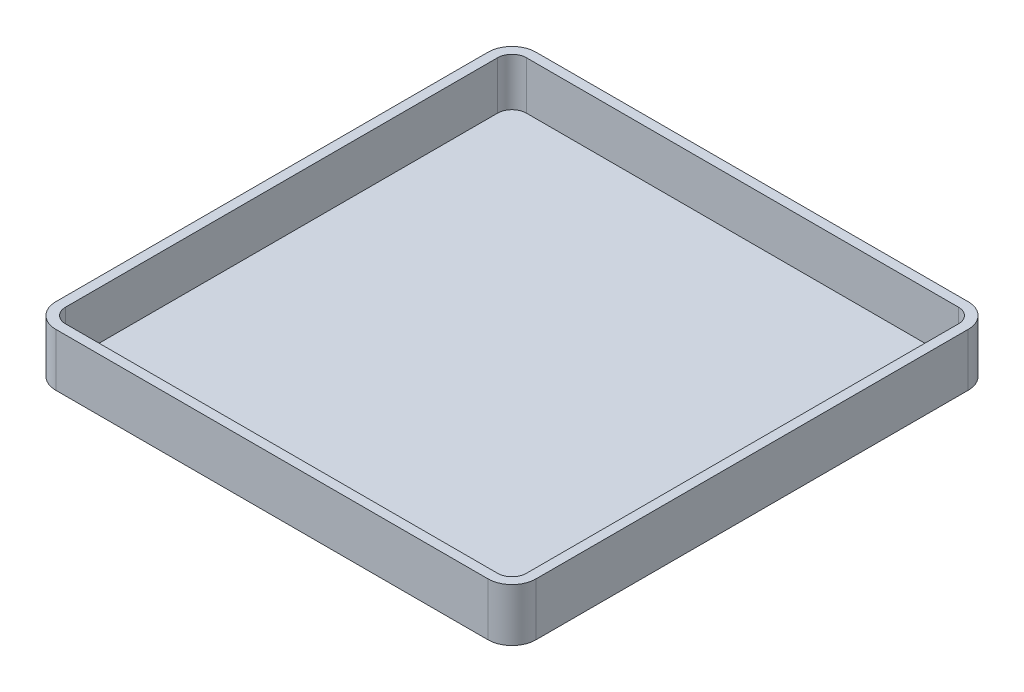
ISO-10303-21;
HEADER;
FILE_DESCRIPTION(('STEP AP214'),'2;1');
FILE_NAME('part.step','',(''),(''),'','','');
FILE_SCHEMA(('AUTOMOTIVE_DESIGN { 1 0 10303 214 1 1 1 1 }'));
ENDSEC;
DATA;
#1=APPLICATION_CONTEXT('core data for automotive mechanical design processes');
#2=APPLICATION_PROTOCOL_DEFINITION('international standard','automotive_design',2000,#1);
#3=PRODUCT_CONTEXT('',#1,'mechanical');
#4=PRODUCT('Part','Part','',(#3));
#5=PRODUCT_RELATED_PRODUCT_CATEGORY('part','',(#4));
#6=PRODUCT_DEFINITION_FORMATION('','',#4);
#7=PRODUCT_DEFINITION_CONTEXT('part definition',#1,'design');
#8=PRODUCT_DEFINITION('design','',#6,#7);
#9=PRODUCT_DEFINITION_SHAPE('','',#8);
#10=(LENGTH_UNIT() NAMED_UNIT(*) SI_UNIT(.MILLI.,.METRE.));
#11=(NAMED_UNIT(*) PLANE_ANGLE_UNIT() SI_UNIT($,.RADIAN.));
#12=(NAMED_UNIT(*) SI_UNIT($,.STERADIAN.) SOLID_ANGLE_UNIT());
#13=UNCERTAINTY_MEASURE_WITH_UNIT(LENGTH_MEASURE(1.E-05),#10,'distance_accuracy_value','');
#14=(GEOMETRIC_REPRESENTATION_CONTEXT(3) GLOBAL_UNCERTAINTY_ASSIGNED_CONTEXT((#13)) GLOBAL_UNIT_ASSIGNED_CONTEXT((#10,
#11,#12)) REPRESENTATION_CONTEXT('',''));
#15=CARTESIAN_POINT('',(0.,0.,0.));
#16=DIRECTION('',(0.,0.,1.));
#17=DIRECTION('',(1.,0.,0.));
#18=AXIS2_PLACEMENT_3D('',#15,#16,#17);
#19=CARTESIAN_POINT('',(0.,10.,0.));
#20=DIRECTION('',(0.,1.,0.));
#21=DIRECTION('',(0.,0.,1.));
#22=AXIS2_PLACEMENT_3D('',#19,#20,#21);
#23=PLANE('',#22);
#24=DIRECTION('',(0.,0.,1.));
#25=VECTOR('',#24,1.);
#26=CARTESIAN_POINT('',(-50.,10.,-50.));
#27=LINE('',#26,#25);
#28=CARTESIAN_POINT('',(-50.,10.,-45.));
#29=VERTEX_POINT('',#28);
#30=CARTESIAN_POINT('',(-50.,10.,45.));
#31=VERTEX_POINT('',#30);
#32=EDGE_CURVE('E262',#29,#31,#27,.T.);
#33=ORIENTED_EDGE('',*,*,#32,.T.);
#34=CARTESIAN_POINT('',(-45.,10.,45.));
#35=DIRECTION('',(0.,1.,0.));
#36=DIRECTION('',(0.,0.,1.));
#37=AXIS2_PLACEMENT_3D('',#34,#35,#36);
#38=CIRCLE('',#37,5.);
#39=CARTESIAN_POINT('',(-45.,10.,50.));
#40=VERTEX_POINT('',#39);
#41=EDGE_CURVE('E284',#31,#40,#38,.T.);
#42=ORIENTED_EDGE('',*,*,#41,.T.);
#43=DIRECTION('',(1.,0.,0.));
#44=VECTOR('',#43,1.);
#45=CARTESIAN_POINT('',(-50.,10.,50.));
#46=LINE('',#45,#44);
#47=CARTESIAN_POINT('',(45.,10.,50.));
#48=VERTEX_POINT('',#47);
#49=EDGE_CURVE('E192',#40,#48,#46,.T.);
#50=ORIENTED_EDGE('',*,*,#49,.T.);
#51=CARTESIAN_POINT('',(45.,10.,45.));
#52=DIRECTION('',(0.,1.,0.));
#53=DIRECTION('',(0.,0.,1.));
#54=AXIS2_PLACEMENT_3D('',#51,#52,#53);
#55=CIRCLE('',#54,5.);
#56=CARTESIAN_POINT('',(50.,10.,45.));
#57=VERTEX_POINT('',#56);
#58=EDGE_CURVE('E186',#48,#57,#55,.T.);
#59=ORIENTED_EDGE('',*,*,#58,.T.);
#60=DIRECTION('',(0.,0.,-1.));
#61=VECTOR('',#60,1.);
#62=CARTESIAN_POINT('',(50.,10.,-50.));
#63=LINE('',#62,#61);
#64=CARTESIAN_POINT('',(50.,10.,-45.));
#65=VERTEX_POINT('',#64);
#66=EDGE_CURVE('E240',#57,#65,#63,.T.);
#67=ORIENTED_EDGE('',*,*,#66,.T.);
#68=CARTESIAN_POINT('',(45.,10.,-45.));
#69=DIRECTION('',(0.,1.,0.));
#70=DIRECTION('',(0.,0.,1.));
#71=AXIS2_PLACEMENT_3D('',#68,#69,#70);
#72=CIRCLE('',#71,5.);
#73=CARTESIAN_POINT('',(45.,10.,-50.));
#74=VERTEX_POINT('',#73);
#75=EDGE_CURVE('E278',#65,#74,#72,.T.);
#76=ORIENTED_EDGE('',*,*,#75,.T.);
#77=DIRECTION('',(-1.,0.,0.));
#78=VECTOR('',#77,1.);
#79=CARTESIAN_POINT('',(-50.,10.,-50.));
#80=LINE('',#79,#78);
#81=CARTESIAN_POINT('',(-45.,10.,-50.));
#82=VERTEX_POINT('',#81);
#83=EDGE_CURVE('E258',#74,#82,#80,.T.);
#84=ORIENTED_EDGE('',*,*,#83,.T.);
#85=CARTESIAN_POINT('',(-45.,10.,-45.));
#86=DIRECTION('',(0.,1.,0.));
#87=DIRECTION('',(0.,0.,1.));
#88=AXIS2_PLACEMENT_3D('',#85,#86,#87);
#89=CIRCLE('',#88,5.);
#90=EDGE_CURVE('E281',#82,#29,#89,.T.);
#91=ORIENTED_EDGE('',*,*,#90,.T.);
#92=EDGE_LOOP('',(#33,#42,#50,#59,#67,#76,#84,#91));
#93=FACE_BOUND('',#92,.T.);
#94=DIRECTION('',(-1.,0.,0.));
#95=VECTOR('',#94,1.);
#96=CARTESIAN_POINT('',(-50.,10.,-48.));
#97=LINE('',#96,#95);
#98=CARTESIAN_POINT('',(45.,10.,-48.));
#99=VERTEX_POINT('',#98);
#100=CARTESIAN_POINT('',(-45.,10.,-48.));
#101=VERTEX_POINT('',#100);
#102=EDGE_CURVE('E228',#99,#101,#97,.T.);
#103=ORIENTED_EDGE('',*,*,#102,.F.);
#104=CARTESIAN_POINT('',(45.,10.,-45.));
#105=DIRECTION('',(0.,1.,0.));
#106=DIRECTION('',(0.,0.,1.));
#107=AXIS2_PLACEMENT_3D('',#104,#105,#106);
#108=CIRCLE('',#107,3.);
#109=CARTESIAN_POINT('',(48.,10.,-45.));
#110=VERTEX_POINT('',#109);
#111=EDGE_CURVE('E344',#99,#110,#108,.F.);
#112=ORIENTED_EDGE('',*,*,#111,.T.);
#113=DIRECTION('',(0.,0.,-1.));
#114=VECTOR('',#113,1.);
#115=CARTESIAN_POINT('',(48.,10.,-50.));
#116=LINE('',#115,#114);
#117=CARTESIAN_POINT('',(48.,10.,45.));
#118=VERTEX_POINT('',#117);
#119=EDGE_CURVE('E224',#118,#110,#116,.T.);
#120=ORIENTED_EDGE('',*,*,#119,.F.);
#121=CARTESIAN_POINT('',(45.,10.,45.));
#122=DIRECTION('',(0.,1.,0.));
#123=DIRECTION('',(0.,0.,1.));
#124=AXIS2_PLACEMENT_3D('',#121,#122,#123);
#125=CIRCLE('',#124,3.);
#126=CARTESIAN_POINT('',(45.,10.,48.));
#127=VERTEX_POINT('',#126);
#128=EDGE_CURVE('E337',#118,#127,#125,.F.);
#129=ORIENTED_EDGE('',*,*,#128,.T.);
#130=DIRECTION('',(1.,0.,0.));
#131=VECTOR('',#130,1.);
#132=CARTESIAN_POINT('',(-50.,10.,48.));
#133=LINE('',#132,#131);
#134=CARTESIAN_POINT('',(-45.,10.,48.));
#135=VERTEX_POINT('',#134);
#136=EDGE_CURVE('E236',#135,#127,#133,.T.);
#137=ORIENTED_EDGE('',*,*,#136,.F.);
#138=CARTESIAN_POINT('',(-45.,10.,45.));
#139=DIRECTION('',(0.,1.,0.));
#140=DIRECTION('',(0.,0.,1.));
#141=AXIS2_PLACEMENT_3D('',#138,#139,#140);
#142=CIRCLE('',#141,3.);
#143=CARTESIAN_POINT('',(-48.,10.,45.));
#144=VERTEX_POINT('',#143);
#145=EDGE_CURVE('E330',#135,#144,#142,.F.);
#146=ORIENTED_EDGE('',*,*,#145,.T.);
#147=DIRECTION('',(0.,0.,1.));
#148=VECTOR('',#147,1.);
#149=CARTESIAN_POINT('',(-48.,10.,-50.));
#150=LINE('',#149,#148);
#151=CARTESIAN_POINT('',(-48.,10.,-45.));
#152=VERTEX_POINT('',#151);
#153=EDGE_CURVE('E232',#152,#144,#150,.T.);
#154=ORIENTED_EDGE('',*,*,#153,.F.);
#155=CARTESIAN_POINT('',(-45.,10.,-45.));
#156=DIRECTION('',(0.,1.,0.));
#157=DIRECTION('',(0.,0.,1.));
#158=AXIS2_PLACEMENT_3D('',#155,#156,#157);
#159=CIRCLE('',#158,3.);
#160=EDGE_CURVE('E12',#152,#101,#159,.F.);
#161=ORIENTED_EDGE('',*,*,#160,.T.);
#162=EDGE_LOOP('',(#103,#112,#120,#129,#137,#146,#154,#161));
#163=FACE_BOUND('',#162,.T.);
#164=ADVANCED_FACE('F67',(#93,#163),#23,.T.);
#165=CARTESIAN_POINT('',(50.,10.,-50.));
#166=DIRECTION('',(-1.,0.,0.));
#167=DIRECTION('',(0.,0.,1.));
#168=AXIS2_PLACEMENT_3D('',#165,#166,#167);
#169=PLANE('',#168);
#170=DIRECTION('',(0.,-1.,0.));
#171=VECTOR('',#170,1.);
#172=CARTESIAN_POINT('',(50.,10.,45.));
#173=LINE('',#172,#171);
#174=CARTESIAN_POINT('',(50.,-1.,45.));
#175=VERTEX_POINT('',#174);
#176=EDGE_CURVE('E293',#57,#175,#173,.T.);
#177=ORIENTED_EDGE('',*,*,#176,.T.);
#178=DIRECTION('',(0.,0.,1.));
#179=VECTOR('',#178,1.);
#180=CARTESIAN_POINT('',(50.,-1.,-45.));
#181=LINE('',#180,#179);
#182=CARTESIAN_POINT('',(50.,-1.,-45.));
#183=VERTEX_POINT('',#182);
#184=EDGE_CURVE('E207',#183,#175,#181,.T.);
#185=ORIENTED_EDGE('',*,*,#184,.F.);
#186=DIRECTION('',(0.,-1.,0.));
#187=VECTOR('',#186,1.);
#188=CARTESIAN_POINT('',(50.,10.,-45.));
#189=LINE('',#188,#187);
#190=EDGE_CURVE('E296',#183,#65,#189,.F.);
#191=ORIENTED_EDGE('',*,*,#190,.T.);
#192=ORIENTED_EDGE('',*,*,#66,.F.);
#193=EDGE_LOOP('',(#177,#185,#191,#192));
#194=FACE_BOUND('',#193,.T.);
#195=ADVANCED_FACE('F386',(#194),#169,.F.);
#196=CARTESIAN_POINT('',(-50.,10.,-50.));
#197=DIRECTION('',(0.,0.,1.));
#198=DIRECTION('',(1.,0.,0.));
#199=AXIS2_PLACEMENT_3D('',#196,#197,#198);
#200=PLANE('',#199);
#201=DIRECTION('',(0.,-1.,0.));
#202=VECTOR('',#201,1.);
#203=CARTESIAN_POINT('',(45.,10.,-50.));
#204=LINE('',#203,#202);
#205=CARTESIAN_POINT('',(45.,-1.,-50.));
#206=VERTEX_POINT('',#205);
#207=EDGE_CURVE('E287',#74,#206,#204,.T.);
#208=ORIENTED_EDGE('',*,*,#207,.T.);
#209=DIRECTION('',(1.,0.,0.));
#210=VECTOR('',#209,1.);
#211=CARTESIAN_POINT('',(-45.,-1.,-50.));
#212=LINE('',#211,#210);
#213=CARTESIAN_POINT('',(-45.,-1.,-50.));
#214=VERTEX_POINT('',#213);
#215=EDGE_CURVE('E217',#214,#206,#212,.T.);
#216=ORIENTED_EDGE('',*,*,#215,.F.);
#217=DIRECTION('',(0.,-1.,0.));
#218=VECTOR('',#217,1.);
#219=CARTESIAN_POINT('',(-45.,10.,-50.));
#220=LINE('',#219,#218);
#221=EDGE_CURVE('E290',#214,#82,#220,.F.);
#222=ORIENTED_EDGE('',*,*,#221,.T.);
#223=ORIENTED_EDGE('',*,*,#83,.F.);
#224=EDGE_LOOP('',(#208,#216,#222,#223));
#225=FACE_BOUND('',#224,.T.);
#226=ADVANCED_FACE('F392',(#225),#200,.F.);
#227=CARTESIAN_POINT('',(-50.,10.,-50.));
#228=DIRECTION('',(1.,0.,0.));
#229=DIRECTION('',(0.,0.,-1.));
#230=AXIS2_PLACEMENT_3D('',#227,#228,#229);
#231=PLANE('',#230);
#232=DIRECTION('',(0.,-1.,0.));
#233=VECTOR('',#232,1.);
#234=CARTESIAN_POINT('',(-50.,10.,-45.));
#235=LINE('',#234,#233);
#236=CARTESIAN_POINT('',(-50.,-1.,-45.));
#237=VERTEX_POINT('',#236);
#238=EDGE_CURVE('E270',#29,#237,#235,.T.);
#239=ORIENTED_EDGE('',*,*,#238,.T.);
#240=DIRECTION('',(0.,0.,-1.));
#241=VECTOR('',#240,1.);
#242=CARTESIAN_POINT('',(-50.,-1.,45.));
#243=LINE('',#242,#241);
#244=CARTESIAN_POINT('',(-50.,-1.,45.));
#245=VERTEX_POINT('',#244);
#246=EDGE_CURVE('E211',#245,#237,#243,.T.);
#247=ORIENTED_EDGE('',*,*,#246,.F.);
#248=DIRECTION('',(0.,-1.,0.));
#249=VECTOR('',#248,1.);
#250=CARTESIAN_POINT('',(-50.,10.,45.));
#251=LINE('',#250,#249);
#252=EDGE_CURVE('E273',#245,#31,#251,.F.);
#253=ORIENTED_EDGE('',*,*,#252,.T.);
#254=ORIENTED_EDGE('',*,*,#32,.F.);
#255=EDGE_LOOP('',(#239,#247,#253,#254));
#256=FACE_BOUND('',#255,.T.);
#257=ADVANCED_FACE('F399',(#256),#231,.F.);
#258=CARTESIAN_POINT('',(-50.,10.,50.));
#259=DIRECTION('',(0.,0.,-1.));
#260=DIRECTION('',(-1.,0.,0.));
#261=AXIS2_PLACEMENT_3D('',#258,#259,#260);
#262=PLANE('',#261);
#263=ORIENTED_EDGE('',*,*,#49,.F.);
#264=DIRECTION('',(0.,-1.,0.));
#265=VECTOR('',#264,1.);
#266=CARTESIAN_POINT('',(-45.,10.,50.));
#267=LINE('',#266,#265);
#268=CARTESIAN_POINT('',(-45.,-1.,50.));
#269=VERTEX_POINT('',#268);
#270=EDGE_CURVE('E191',#40,#269,#267,.T.);
#271=ORIENTED_EDGE('',*,*,#270,.T.);
#272=DIRECTION('',(-1.,0.,0.));
#273=VECTOR('',#272,1.);
#274=CARTESIAN_POINT('',(45.,-1.,50.));
#275=LINE('',#274,#273);
#276=CARTESIAN_POINT('',(45.,-1.,50.));
#277=VERTEX_POINT('',#276);
#278=EDGE_CURVE('E195',#277,#269,#275,.T.);
#279=ORIENTED_EDGE('',*,*,#278,.F.);
#280=DIRECTION('',(0.,-1.,0.));
#281=VECTOR('',#280,1.);
#282=CARTESIAN_POINT('',(45.,10.,50.));
#283=LINE('',#282,#281);
#284=EDGE_CURVE('E180',#277,#48,#283,.F.);
#285=ORIENTED_EDGE('',*,*,#284,.T.);
#286=EDGE_LOOP('',(#263,#271,#279,#285));
#287=FACE_BOUND('',#286,.T.);
#288=ADVANCED_FACE('F196',(#287),#262,.F.);
#289=CARTESIAN_POINT('',(48.,10.,-50.));
#290=DIRECTION('',(-1.,0.,0.));
#291=DIRECTION('',(0.,0.,1.));
#292=AXIS2_PLACEMENT_3D('',#289,#290,#291);
#293=PLANE('',#292);
#294=DIRECTION('',(0.,0.,-1.));
#295=VECTOR('',#294,1.);
#296=CARTESIAN_POINT('',(48.,0.,-50.));
#297=LINE('',#296,#295);
#298=CARTESIAN_POINT('',(48.,0.,45.));
#299=VERTEX_POINT('',#298);
#300=CARTESIAN_POINT('',(48.,0.,-45.));
#301=VERTEX_POINT('',#300);
#302=EDGE_CURVE('E223',#299,#301,#297,.T.);
#303=ORIENTED_EDGE('',*,*,#302,.F.);
#304=DIRECTION('',(0.,-1.,0.));
#305=VECTOR('',#304,1.);
#306=CARTESIAN_POINT('',(48.,10.,45.));
#307=LINE('',#306,#305);
#308=EDGE_CURVE('E317',#299,#118,#307,.F.);
#309=ORIENTED_EDGE('',*,*,#308,.T.);
#310=ORIENTED_EDGE('',*,*,#119,.T.);
#311=DIRECTION('',(0.,-1.,0.));
#312=VECTOR('',#311,1.);
#313=CARTESIAN_POINT('',(48.,0.,-45.));
#314=LINE('',#313,#312);
#315=EDGE_CURVE('E313',#110,#301,#314,.T.);
#316=ORIENTED_EDGE('',*,*,#315,.T.);
#317=EDGE_LOOP('',(#303,#309,#310,#316));
#318=FACE_BOUND('',#317,.T.);
#319=ADVANCED_FACE('F360',(#318),#293,.T.);
#320=CARTESIAN_POINT('',(-50.,10.,-48.));
#321=DIRECTION('',(0.,0.,1.));
#322=DIRECTION('',(1.,0.,0.));
#323=AXIS2_PLACEMENT_3D('',#320,#321,#322);
#324=PLANE('',#323);
#325=DIRECTION('',(-1.,0.,0.));
#326=VECTOR('',#325,1.);
#327=CARTESIAN_POINT('',(-50.,0.,-48.));
#328=LINE('',#327,#326);
#329=CARTESIAN_POINT('',(45.,0.,-48.));
#330=VERTEX_POINT('',#329);
#331=CARTESIAN_POINT('',(-45.,0.,-48.));
#332=VERTEX_POINT('',#331);
#333=EDGE_CURVE('E244',#330,#332,#328,.T.);
#334=ORIENTED_EDGE('',*,*,#333,.F.);
#335=DIRECTION('',(0.,-1.,0.));
#336=VECTOR('',#335,1.);
#337=CARTESIAN_POINT('',(45.,10.,-48.));
#338=LINE('',#337,#336);
#339=EDGE_CURVE('E88',#330,#99,#338,.F.);
#340=ORIENTED_EDGE('',*,*,#339,.T.);
#341=ORIENTED_EDGE('',*,*,#102,.T.);
#342=DIRECTION('',(0.,-1.,0.));
#343=VECTOR('',#342,1.);
#344=CARTESIAN_POINT('',(-45.,0.,-48.));
#345=LINE('',#344,#343);
#346=EDGE_CURVE('E320',#101,#332,#345,.T.);
#347=ORIENTED_EDGE('',*,*,#346,.T.);
#348=EDGE_LOOP('',(#334,#340,#341,#347));
#349=FACE_BOUND('',#348,.T.);
#350=ADVANCED_FACE('F353',(#349),#324,.T.);
#351=CARTESIAN_POINT('',(-48.,10.,-50.));
#352=DIRECTION('',(1.,0.,0.));
#353=DIRECTION('',(0.,0.,-1.));
#354=AXIS2_PLACEMENT_3D('',#351,#352,#353);
#355=PLANE('',#354);
#356=ORIENTED_EDGE('',*,*,#153,.T.);
#357=DIRECTION('',(0.,-1.,0.));
#358=VECTOR('',#357,1.);
#359=CARTESIAN_POINT('',(-48.,0.,45.));
#360=LINE('',#359,#358);
#361=CARTESIAN_POINT('',(-48.,0.,45.));
#362=VERTEX_POINT('',#361);
#363=EDGE_CURVE('E302',#144,#362,#360,.T.);
#364=ORIENTED_EDGE('',*,*,#363,.T.);
#365=DIRECTION('',(0.,0.,1.));
#366=VECTOR('',#365,1.);
#367=CARTESIAN_POINT('',(-48.,0.,-50.));
#368=LINE('',#367,#366);
#369=CARTESIAN_POINT('',(-48.,0.,-45.));
#370=VERTEX_POINT('',#369);
#371=EDGE_CURVE('E248',#370,#362,#368,.T.);
#372=ORIENTED_EDGE('',*,*,#371,.F.);
#373=DIRECTION('',(0.,-1.,0.));
#374=VECTOR('',#373,1.);
#375=CARTESIAN_POINT('',(-48.,10.,-45.));
#376=LINE('',#375,#374);
#377=EDGE_CURVE('E299',#370,#152,#376,.F.);
#378=ORIENTED_EDGE('',*,*,#377,.T.);
#379=EDGE_LOOP('',(#356,#364,#372,#378));
#380=FACE_BOUND('',#379,.T.);
#381=ADVANCED_FACE('F375',(#380),#355,.T.);
#382=CARTESIAN_POINT('',(-50.,10.,48.));
#383=DIRECTION('',(0.,0.,-1.));
#384=DIRECTION('',(-1.,0.,0.));
#385=AXIS2_PLACEMENT_3D('',#382,#383,#384);
#386=PLANE('',#385);
#387=DIRECTION('',(1.,0.,0.));
#388=VECTOR('',#387,1.);
#389=CARTESIAN_POINT('',(-50.,0.,48.));
#390=LINE('',#389,#388);
#391=CARTESIAN_POINT('',(-45.,0.,48.));
#392=VERTEX_POINT('',#391);
#393=CARTESIAN_POINT('',(45.,0.,48.));
#394=VERTEX_POINT('',#393);
#395=EDGE_CURVE('E229',#392,#394,#390,.T.);
#396=ORIENTED_EDGE('',*,*,#395,.F.);
#397=DIRECTION('',(0.,-1.,0.));
#398=VECTOR('',#397,1.);
#399=CARTESIAN_POINT('',(-45.,10.,48.));
#400=LINE('',#399,#398);
#401=EDGE_CURVE('E310',#392,#135,#400,.F.);
#402=ORIENTED_EDGE('',*,*,#401,.T.);
#403=ORIENTED_EDGE('',*,*,#136,.T.);
#404=DIRECTION('',(0.,-1.,0.));
#405=VECTOR('',#404,1.);
#406=CARTESIAN_POINT('',(45.,0.,48.));
#407=LINE('',#406,#405);
#408=EDGE_CURVE('E306',#127,#394,#407,.T.);
#409=ORIENTED_EDGE('',*,*,#408,.T.);
#410=EDGE_LOOP('',(#396,#402,#403,#409));
#411=FACE_BOUND('',#410,.T.);
#412=ADVANCED_FACE('F368',(#411),#386,.T.);
#413=CARTESIAN_POINT('',(-45.,10.,45.));
#414=DIRECTION('',(0.,-1.,0.));
#415=DIRECTION('',(0.,0.,-1.));
#416=AXIS2_PLACEMENT_3D('',#413,#414,#415);
#417=CYLINDRICAL_SURFACE('',#416,5.);
#418=ORIENTED_EDGE('',*,*,#41,.F.);
#419=ORIENTED_EDGE('',*,*,#252,.F.);
#420=CARTESIAN_POINT('',(-45.,-1.,45.));
#421=DIRECTION('',(0.,-1.,0.));
#422=DIRECTION('',(0.,0.,-1.));
#423=AXIS2_PLACEMENT_3D('',#420,#421,#422);
#424=CIRCLE('',#423,5.);
#425=EDGE_CURVE('E201',#269,#245,#424,.T.);
#426=ORIENTED_EDGE('',*,*,#425,.F.);
#427=ORIENTED_EDGE('',*,*,#270,.F.);
#428=EDGE_LOOP('',(#418,#419,#426,#427));
#429=FACE_BOUND('',#428,.T.);
#430=ADVANCED_FACE('F382',(#429),#417,.T.);
#431=CARTESIAN_POINT('',(-45.,10.,-45.));
#432=DIRECTION('',(0.,-1.,0.));
#433=DIRECTION('',(0.,0.,-1.));
#434=AXIS2_PLACEMENT_3D('',#431,#432,#433);
#435=CYLINDRICAL_SURFACE('',#434,5.);
#436=ORIENTED_EDGE('',*,*,#90,.F.);
#437=ORIENTED_EDGE('',*,*,#221,.F.);
#438=CARTESIAN_POINT('',(-45.,-1.,-45.));
#439=DIRECTION('',(0.,-1.,0.));
#440=DIRECTION('',(0.,0.,-1.));
#441=AXIS2_PLACEMENT_3D('',#438,#439,#440);
#442=CIRCLE('',#441,5.);
#443=EDGE_CURVE('E214',#237,#214,#442,.T.);
#444=ORIENTED_EDGE('',*,*,#443,.F.);
#445=ORIENTED_EDGE('',*,*,#238,.F.);
#446=EDGE_LOOP('',(#436,#437,#444,#445));
#447=FACE_BOUND('',#446,.T.);
#448=ADVANCED_FACE('F408',(#447),#435,.T.);
#449=CARTESIAN_POINT('',(45.,10.,-45.));
#450=DIRECTION('',(0.,-1.,0.));
#451=DIRECTION('',(0.,0.,-1.));
#452=AXIS2_PLACEMENT_3D('',#449,#450,#451);
#453=CYLINDRICAL_SURFACE('',#452,5.);
#454=ORIENTED_EDGE('',*,*,#75,.F.);
#455=ORIENTED_EDGE('',*,*,#190,.F.);
#456=CARTESIAN_POINT('',(45.,-1.,-45.));
#457=DIRECTION('',(0.,-1.,0.));
#458=DIRECTION('',(0.,0.,-1.));
#459=AXIS2_PLACEMENT_3D('',#456,#457,#458);
#460=CIRCLE('',#459,5.);
#461=EDGE_CURVE('E220',#206,#183,#460,.T.);
#462=ORIENTED_EDGE('',*,*,#461,.F.);
#463=ORIENTED_EDGE('',*,*,#207,.F.);
#464=EDGE_LOOP('',(#454,#455,#462,#463));
#465=FACE_BOUND('',#464,.T.);
#466=ADVANCED_FACE('F412',(#465),#453,.T.);
#467=CARTESIAN_POINT('',(45.,10.,45.));
#468=DIRECTION('',(0.,-1.,0.));
#469=DIRECTION('',(0.,0.,-1.));
#470=AXIS2_PLACEMENT_3D('',#467,#468,#469);
#471=CYLINDRICAL_SURFACE('',#470,5.);
#472=ORIENTED_EDGE('',*,*,#58,.F.);
#473=ORIENTED_EDGE('',*,*,#284,.F.);
#474=CARTESIAN_POINT('',(45.,-1.,45.));
#475=DIRECTION('',(0.,-1.,0.));
#476=DIRECTION('',(0.,0.,-1.));
#477=AXIS2_PLACEMENT_3D('',#474,#475,#476);
#478=CIRCLE('',#477,5.);
#479=EDGE_CURVE('E185',#175,#277,#478,.T.);
#480=ORIENTED_EDGE('',*,*,#479,.F.);
#481=ORIENTED_EDGE('',*,*,#176,.F.);
#482=EDGE_LOOP('',(#472,#473,#480,#481));
#483=FACE_BOUND('',#482,.T.);
#484=ADVANCED_FACE('F182',(#483),#471,.T.);
#485=CARTESIAN_POINT('',(-45.,10.,45.));
#486=DIRECTION('',(0.,1.,0.));
#487=DIRECTION('',(0.,0.,1.));
#488=AXIS2_PLACEMENT_3D('',#485,#486,#487);
#489=CYLINDRICAL_SURFACE('',#488,3.);
#490=ORIENTED_EDGE('',*,*,#145,.F.);
#491=ORIENTED_EDGE('',*,*,#401,.F.);
#492=CARTESIAN_POINT('',(-45.,0.,45.));
#493=DIRECTION('',(0.,1.,0.));
#494=DIRECTION('',(0.,0.,1.));
#495=AXIS2_PLACEMENT_3D('',#492,#493,#494);
#496=CIRCLE('',#495,3.);
#497=EDGE_CURVE('E326',#362,#392,#496,.T.);
#498=ORIENTED_EDGE('',*,*,#497,.F.);
#499=ORIENTED_EDGE('',*,*,#363,.F.);
#500=EDGE_LOOP('',(#490,#491,#498,#499));
#501=FACE_BOUND('',#500,.T.);
#502=ADVANCED_FACE('F373',(#501),#489,.F.);
#503=CARTESIAN_POINT('',(45.,10.,45.));
#504=DIRECTION('',(0.,1.,0.));
#505=DIRECTION('',(0.,0.,1.));
#506=AXIS2_PLACEMENT_3D('',#503,#504,#505);
#507=CYLINDRICAL_SURFACE('',#506,3.);
#508=ORIENTED_EDGE('',*,*,#128,.F.);
#509=ORIENTED_EDGE('',*,*,#308,.F.);
#510=CARTESIAN_POINT('',(45.,0.,45.));
#511=DIRECTION('',(0.,1.,0.));
#512=DIRECTION('',(0.,0.,1.));
#513=AXIS2_PLACEMENT_3D('',#510,#511,#512);
#514=CIRCLE('',#513,3.);
#515=EDGE_CURVE('E333',#394,#299,#514,.T.);
#516=ORIENTED_EDGE('',*,*,#515,.F.);
#517=ORIENTED_EDGE('',*,*,#408,.F.);
#518=EDGE_LOOP('',(#508,#509,#516,#517));
#519=FACE_BOUND('',#518,.T.);
#520=ADVANCED_FACE('F366',(#519),#507,.F.);
#521=CARTESIAN_POINT('',(45.,10.,-45.));
#522=DIRECTION('',(0.,1.,0.));
#523=DIRECTION('',(0.,0.,1.));
#524=AXIS2_PLACEMENT_3D('',#521,#522,#523);
#525=CYLINDRICAL_SURFACE('',#524,3.);
#526=ORIENTED_EDGE('',*,*,#111,.F.);
#527=ORIENTED_EDGE('',*,*,#339,.F.);
#528=CARTESIAN_POINT('',(45.,0.,-45.));
#529=DIRECTION('',(0.,1.,0.));
#530=DIRECTION('',(0.,0.,1.));
#531=AXIS2_PLACEMENT_3D('',#528,#529,#530);
#532=CIRCLE('',#531,3.);
#533=EDGE_CURVE('E340',#301,#330,#532,.T.);
#534=ORIENTED_EDGE('',*,*,#533,.F.);
#535=ORIENTED_EDGE('',*,*,#315,.F.);
#536=EDGE_LOOP('',(#526,#527,#534,#535));
#537=FACE_BOUND('',#536,.T.);
#538=ADVANCED_FACE('F358',(#537),#525,.F.);
#539=CARTESIAN_POINT('',(-45.,10.,-45.));
#540=DIRECTION('',(0.,1.,0.));
#541=DIRECTION('',(0.,0.,1.));
#542=AXIS2_PLACEMENT_3D('',#539,#540,#541);
#543=CYLINDRICAL_SURFACE('',#542,3.);
#544=ORIENTED_EDGE('',*,*,#160,.F.);
#545=ORIENTED_EDGE('',*,*,#377,.F.);
#546=CARTESIAN_POINT('',(-45.,0.,-45.));
#547=DIRECTION('',(0.,1.,0.));
#548=DIRECTION('',(0.,0.,1.));
#549=AXIS2_PLACEMENT_3D('',#546,#547,#548);
#550=CIRCLE('',#549,3.);
#551=EDGE_CURVE('E76',#332,#370,#550,.T.);
#552=ORIENTED_EDGE('',*,*,#551,.F.);
#553=ORIENTED_EDGE('',*,*,#346,.F.);
#554=EDGE_LOOP('',(#544,#545,#552,#553));
#555=FACE_BOUND('',#554,.T.);
#556=ADVANCED_FACE('F69',(#555),#543,.F.);
#557=CARTESIAN_POINT('',(45.,0.,45.));
#558=DIRECTION('',(0.,-1.,0.));
#559=DIRECTION('',(0.,0.,-1.));
#560=AXIS2_PLACEMENT_3D('',#557,#558,#559);
#561=PLANE('',#560);
#562=ORIENTED_EDGE('',*,*,#497,.T.);
#563=ORIENTED_EDGE('',*,*,#395,.T.);
#564=ORIENTED_EDGE('',*,*,#515,.T.);
#565=ORIENTED_EDGE('',*,*,#302,.T.);
#566=ORIENTED_EDGE('',*,*,#533,.T.);
#567=ORIENTED_EDGE('',*,*,#333,.T.);
#568=ORIENTED_EDGE('',*,*,#551,.T.);
#569=ORIENTED_EDGE('',*,*,#371,.T.);
#570=EDGE_LOOP('',(#562,#563,#564,#565,#566,#567,#568,#569));
#571=FACE_BOUND('',#570,.T.);
#572=ADVANCED_FACE('F349',(#571),#561,.F.);
#573=CARTESIAN_POINT('',(45.,-1.,45.));
#574=DIRECTION('',(0.,-1.,0.));
#575=DIRECTION('',(0.,0.,-1.));
#576=AXIS2_PLACEMENT_3D('',#573,#574,#575);
#577=PLANE('',#576);
#578=ORIENTED_EDGE('',*,*,#479,.T.);
#579=ORIENTED_EDGE('',*,*,#278,.T.);
#580=ORIENTED_EDGE('',*,*,#425,.T.);
#581=ORIENTED_EDGE('',*,*,#246,.T.);
#582=ORIENTED_EDGE('',*,*,#443,.T.);
#583=ORIENTED_EDGE('',*,*,#215,.T.);
#584=ORIENTED_EDGE('',*,*,#461,.T.);
#585=ORIENTED_EDGE('',*,*,#184,.T.);
#586=EDGE_LOOP('',(#578,#579,#580,#581,#582,#583,#584,#585));
#587=FACE_BOUND('',#586,.T.);
#588=ADVANCED_FACE('F204',(#587),#577,.T.);
#589=CLOSED_SHELL('',(#164,#195,#226,#257,#288,#319,#350,#381,#412,#430,#448,#466,#484,#502,
#520,#538,#556,#572,#588));
#590=MANIFOLD_SOLID_BREP('B2',#589);
#591=ADVANCED_BREP_SHAPE_REPRESENTATION('',(#18,#590),#14);
#592=SHAPE_DEFINITION_REPRESENTATION(#9,#591);
ENDSEC;
END-ISO-10303-21;
